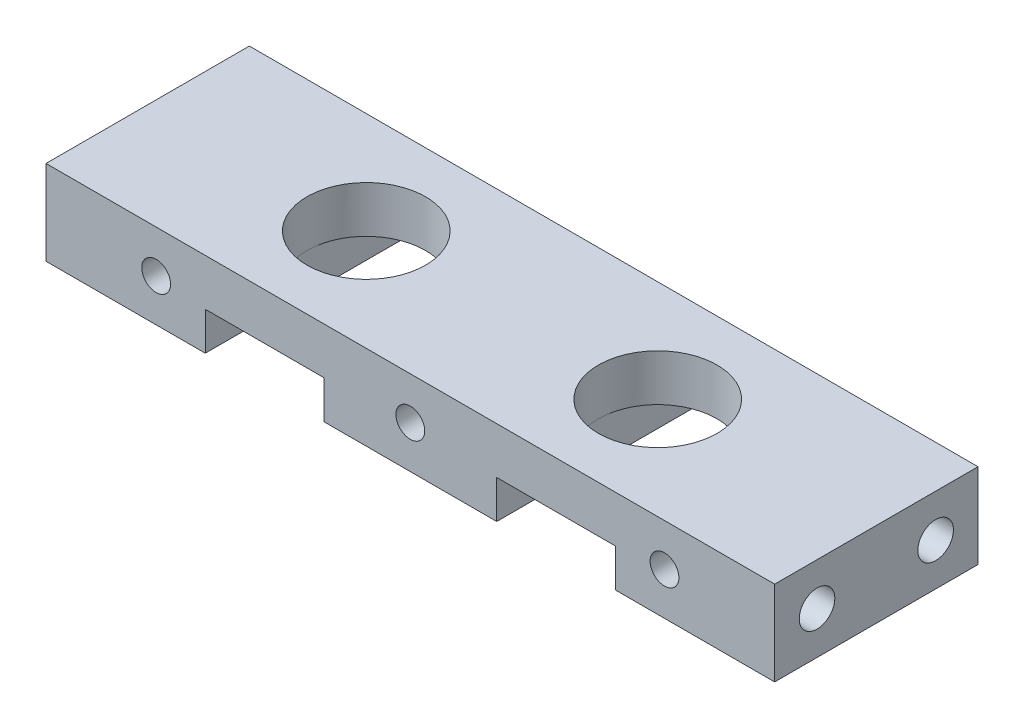
ISO-10303-21;
HEADER;
FILE_DESCRIPTION(('STEP AP214'),'2;1');
FILE_NAME('part.step','',(''),(''),'','','');
FILE_SCHEMA(('AUTOMOTIVE_DESIGN { 1 0 10303 214 1 1 1 1 }'));
ENDSEC;
DATA;
#1=APPLICATION_CONTEXT('core data for automotive mechanical design processes');
#2=APPLICATION_PROTOCOL_DEFINITION('international standard','automotive_design',2000,#1);
#3=PRODUCT_CONTEXT('',#1,'mechanical');
#4=PRODUCT('Part','Part','',(#3));
#5=PRODUCT_RELATED_PRODUCT_CATEGORY('part','',(#4));
#6=PRODUCT_DEFINITION_FORMATION('','',#4);
#7=PRODUCT_DEFINITION_CONTEXT('part definition',#1,'design');
#8=PRODUCT_DEFINITION('design','',#6,#7);
#9=PRODUCT_DEFINITION_SHAPE('','',#8);
#10=(LENGTH_UNIT() NAMED_UNIT(*) SI_UNIT(.MILLI.,.METRE.));
#11=(NAMED_UNIT(*) PLANE_ANGLE_UNIT() SI_UNIT($,.RADIAN.));
#12=(NAMED_UNIT(*) SI_UNIT($,.STERADIAN.) SOLID_ANGLE_UNIT());
#13=UNCERTAINTY_MEASURE_WITH_UNIT(LENGTH_MEASURE(1.E-05),#10,'distance_accuracy_value','');
#14=(GEOMETRIC_REPRESENTATION_CONTEXT(3) GLOBAL_UNCERTAINTY_ASSIGNED_CONTEXT((#13)) GLOBAL_UNIT_ASSIGNED_CONTEXT((#10,
#11,#12)) REPRESENTATION_CONTEXT('',''));
#15=CARTESIAN_POINT('',(0.,0.,0.));
#16=DIRECTION('',(0.,0.,1.));
#17=DIRECTION('',(1.,0.,0.));
#18=AXIS2_PLACEMENT_3D('',#15,#16,#17);
#19=CARTESIAN_POINT('',(17.5,2.5,-3.5));
#20=DIRECTION('',(-1.,0.,0.));
#21=DIRECTION('',(0.,0.,1.));
#22=AXIS2_PLACEMENT_3D('',#19,#20,#21);
#23=PLANE('',#22);
#24=CARTESIAN_POINT('',(17.5,2.5,-3.5));
#25=DIRECTION('',(1.,0.,0.));
#26=DIRECTION('',(0.,0.,-1.));
#27=AXIS2_PLACEMENT_3D('',#24,#25,#26);
#28=CIRCLE('',#27,1.05);
#29=CARTESIAN_POINT('',(17.5,2.5,-4.55));
#30=VERTEX_POINT('',#29);
#31=EDGE_CURVE('E38',#30,#30,#28,.T.);
#32=ORIENTED_EDGE('',*,*,#31,.T.);
#33=EDGE_LOOP('',(#32));
#34=FACE_BOUND('',#33,.T.);
#35=ADVANCED_FACE('F35',(#34),#23,.F.);
#36=CARTESIAN_POINT('',(17.5,2.5,3.5));
#37=DIRECTION('',(-1.,0.,0.));
#38=DIRECTION('',(0.,0.,1.));
#39=AXIS2_PLACEMENT_3D('',#36,#37,#38);
#40=PLANE('',#39);
#41=CARTESIAN_POINT('',(17.5,2.5,3.5));
#42=DIRECTION('',(1.,0.,0.));
#43=DIRECTION('',(0.,0.,-1.));
#44=AXIS2_PLACEMENT_3D('',#41,#42,#43);
#45=CIRCLE('',#44,1.05);
#46=CARTESIAN_POINT('',(17.5,2.5,2.45));
#47=VERTEX_POINT('',#46);
#48=EDGE_CURVE('E216',#47,#47,#45,.T.);
#49=ORIENTED_EDGE('',*,*,#48,.T.);
#50=EDGE_LOOP('',(#49));
#51=FACE_BOUND('',#50,.T.);
#52=ADVANCED_FACE('F632',(#51),#40,.F.);
#53=CARTESIAN_POINT('',(-17.5,2.5,-3.5));
#54=DIRECTION('',(-1.,0.,0.));
#55=DIRECTION('',(0.,0.,1.));
#56=AXIS2_PLACEMENT_3D('',#53,#54,#55);
#57=PLANE('',#56);
#58=CARTESIAN_POINT('',(-17.5,2.5,-3.5));
#59=DIRECTION('',(1.,0.,0.));
#60=DIRECTION('',(0.,0.,-1.));
#61=AXIS2_PLACEMENT_3D('',#58,#59,#60);
#62=CIRCLE('',#61,1.05);
#63=CARTESIAN_POINT('',(-17.5,2.5,-4.55));
#64=VERTEX_POINT('',#63);
#65=EDGE_CURVE('E214',#64,#64,#62,.F.);
#66=ORIENTED_EDGE('',*,*,#65,.T.);
#67=EDGE_LOOP('',(#66));
#68=FACE_BOUND('',#67,.T.);
#69=ADVANCED_FACE('F624',(#68),#57,.T.);
#70=CARTESIAN_POINT('',(-17.5,2.5,3.5));
#71=DIRECTION('',(-1.,0.,0.));
#72=DIRECTION('',(0.,0.,1.));
#73=AXIS2_PLACEMENT_3D('',#70,#71,#72);
#74=PLANE('',#73);
#75=CARTESIAN_POINT('',(-17.5,2.5,3.5));
#76=DIRECTION('',(1.,0.,0.));
#77=DIRECTION('',(0.,0.,-1.));
#78=AXIS2_PLACEMENT_3D('',#75,#76,#77);
#79=CIRCLE('',#78,1.05);
#80=CARTESIAN_POINT('',(-17.5,2.5,2.45));
#81=VERTEX_POINT('',#80);
#82=EDGE_CURVE('E210',#81,#81,#79,.F.);
#83=ORIENTED_EDGE('',*,*,#82,.T.);
#84=EDGE_LOOP('',(#83));
#85=FACE_BOUND('',#84,.T.);
#86=ADVANCED_FACE('F228',(#85),#74,.T.);
#87=CARTESIAN_POINT('',(21.5,2.5,-3.5));
#88=DIRECTION('',(1.,0.,0.));
#89=DIRECTION('',(0.,0.,-1.));
#90=AXIS2_PLACEMENT_3D('',#87,#88,#89);
#91=CYLINDRICAL_SURFACE('',#90,1.05);
#92=ORIENTED_EDGE('',*,*,#31,.F.);
#93=EDGE_LOOP('',(#92));
#94=FACE_BOUND('',#93,.T.);
#95=CARTESIAN_POINT('',(21.5,2.5,-3.5));
#96=DIRECTION('',(1.,0.,0.));
#97=DIRECTION('',(0.,0.,-1.));
#98=AXIS2_PLACEMENT_3D('',#95,#96,#97);
#99=CIRCLE('',#98,1.05);
#100=CARTESIAN_POINT('',(21.5,2.5,-4.55));
#101=VERTEX_POINT('',#100);
#102=EDGE_CURVE('E206',#101,#101,#99,.F.);
#103=ORIENTED_EDGE('',*,*,#102,.F.);
#104=EDGE_LOOP('',(#103));
#105=FACE_BOUND('',#104,.T.);
#106=ADVANCED_FACE('F224',(#94,#105),#91,.F.);
#107=CARTESIAN_POINT('',(21.5,2.5,3.5));
#108=DIRECTION('',(1.,0.,0.));
#109=DIRECTION('',(0.,0.,-1.));
#110=AXIS2_PLACEMENT_3D('',#107,#108,#109);
#111=CYLINDRICAL_SURFACE('',#110,1.05);
#112=ORIENTED_EDGE('',*,*,#48,.F.);
#113=EDGE_LOOP('',(#112));
#114=FACE_BOUND('',#113,.T.);
#115=CARTESIAN_POINT('',(21.5,2.5,3.5));
#116=DIRECTION('',(1.,0.,0.));
#117=DIRECTION('',(0.,0.,-1.));
#118=AXIS2_PLACEMENT_3D('',#115,#116,#117);
#119=CIRCLE('',#118,1.05);
#120=CARTESIAN_POINT('',(21.5,2.5,2.45));
#121=VERTEX_POINT('',#120);
#122=EDGE_CURVE('E202',#121,#121,#119,.F.);
#123=ORIENTED_EDGE('',*,*,#122,.F.);
#124=EDGE_LOOP('',(#123));
#125=FACE_BOUND('',#124,.T.);
#126=ADVANCED_FACE('F227',(#114,#125),#111,.F.);
#127=CARTESIAN_POINT('',(-21.5,2.5,-3.5));
#128=DIRECTION('',(1.,0.,0.));
#129=DIRECTION('',(0.,0.,-1.));
#130=AXIS2_PLACEMENT_3D('',#127,#128,#129);
#131=CYLINDRICAL_SURFACE('',#130,1.05);
#132=ORIENTED_EDGE('',*,*,#65,.F.);
#133=EDGE_LOOP('',(#132));
#134=FACE_BOUND('',#133,.T.);
#135=CARTESIAN_POINT('',(-21.5,2.5,-3.5));
#136=DIRECTION('',(1.,0.,0.));
#137=DIRECTION('',(0.,0.,-1.));
#138=AXIS2_PLACEMENT_3D('',#135,#136,#137);
#139=CIRCLE('',#138,1.05);
#140=CARTESIAN_POINT('',(-21.5,2.5,-4.55));
#141=VERTEX_POINT('',#140);
#142=EDGE_CURVE('E187',#141,#141,#139,.T.);
#143=ORIENTED_EDGE('',*,*,#142,.F.);
#144=EDGE_LOOP('',(#143));
#145=FACE_BOUND('',#144,.T.);
#146=ADVANCED_FACE('F589',(#134,#145),#131,.F.);
#147=CARTESIAN_POINT('',(-21.5,2.5,3.5));
#148=DIRECTION('',(1.,0.,0.));
#149=DIRECTION('',(0.,0.,-1.));
#150=AXIS2_PLACEMENT_3D('',#147,#148,#149);
#151=CYLINDRICAL_SURFACE('',#150,1.05);
#152=ORIENTED_EDGE('',*,*,#82,.F.);
#153=EDGE_LOOP('',(#152));
#154=FACE_BOUND('',#153,.T.);
#155=CARTESIAN_POINT('',(-21.5,2.5,3.5));
#156=DIRECTION('',(1.,0.,0.));
#157=DIRECTION('',(0.,0.,-1.));
#158=AXIS2_PLACEMENT_3D('',#155,#156,#157);
#159=CIRCLE('',#158,1.05);
#160=CARTESIAN_POINT('',(-21.5,2.5,2.45));
#161=VERTEX_POINT('',#160);
#162=EDGE_CURVE('E183',#161,#161,#159,.T.);
#163=ORIENTED_EDGE('',*,*,#162,.F.);
#164=EDGE_LOOP('',(#163));
#165=FACE_BOUND('',#164,.T.);
#166=ADVANCED_FACE('F598',(#154,#165),#151,.F.);
#167=CARTESIAN_POINT('',(-5.1,0.,9.06162749492311));
#168=DIRECTION('',(1.,0.,0.));
#169=DIRECTION('',(0.,0.,-1.));
#170=AXIS2_PLACEMENT_3D('',#167,#168,#169);
#171=PLANE('',#170);
#172=DIRECTION('',(0.,0.,-1.));
#173=VECTOR('',#172,1.);
#174=CARTESIAN_POINT('',(-5.1,2.25,4.53081374746156));
#175=LINE('',#174,#173);
#176=CARTESIAN_POINT('',(-5.1,2.25,0.));
#177=VERTEX_POINT('',#176);
#178=CARTESIAN_POINT('',(-5.1,2.25,6.));
#179=VERTEX_POINT('',#178);
#180=EDGE_CURVE('E309',#177,#179,#175,.F.);
#181=ORIENTED_EDGE('',*,*,#180,.F.);
#182=DIRECTION('',(0.,0.,-1.));
#183=VECTOR('',#182,1.);
#184=CARTESIAN_POINT('',(-5.1,2.25,-4.53081374746156));
#185=LINE('',#184,#183);
#186=CARTESIAN_POINT('',(-5.1,2.25,-6.));
#187=VERTEX_POINT('',#186);
#188=EDGE_CURVE('E304',#187,#177,#185,.F.);
#189=ORIENTED_EDGE('',*,*,#188,.F.);
#190=DIRECTION('',(0.,1.,0.));
#191=VECTOR('',#190,1.);
#192=CARTESIAN_POINT('',(-5.1,0.,-6.));
#193=LINE('',#192,#191);
#194=CARTESIAN_POINT('',(-5.1,0.,-6.));
#195=VERTEX_POINT('',#194);
#196=EDGE_CURVE('E287',#195,#187,#193,.T.);
#197=ORIENTED_EDGE('',*,*,#196,.F.);
#198=DIRECTION('',(0.,0.,1.));
#199=VECTOR('',#198,1.);
#200=CARTESIAN_POINT('',(-5.1,0.,0.));
#201=LINE('',#200,#199);
#202=CARTESIAN_POINT('',(-5.1,0.,6.));
#203=VERTEX_POINT('',#202);
#204=EDGE_CURVE('E329',#195,#203,#201,.T.);
#205=ORIENTED_EDGE('',*,*,#204,.T.);
#206=DIRECTION('',(0.,1.,0.));
#207=VECTOR('',#206,1.);
#208=CARTESIAN_POINT('',(-5.1,0.,6.00000000000001));
#209=LINE('',#208,#207);
#210=EDGE_CURVE('E186',#179,#203,#209,.F.);
#211=ORIENTED_EDGE('',*,*,#210,.F.);
#212=EDGE_LOOP('',(#181,#189,#197,#205,#211));
#213=FACE_BOUND('',#212,.T.);
#214=ADVANCED_FACE('F395',(#213),#171,.F.);
#215=CARTESIAN_POINT('',(5.1,0.,-8.60665038220731));
#216=DIRECTION('',(-1.,0.,0.));
#217=DIRECTION('',(0.,0.,1.));
#218=AXIS2_PLACEMENT_3D('',#215,#216,#217);
#219=PLANE('',#218);
#220=DIRECTION('',(0.,0.,-1.));
#221=VECTOR('',#220,1.);
#222=CARTESIAN_POINT('',(5.1,2.25,-4.30332519110366));
#223=LINE('',#222,#221);
#224=CARTESIAN_POINT('',(5.1,2.25,0.));
#225=VERTEX_POINT('',#224);
#226=CARTESIAN_POINT('',(5.1,2.25,-6.));
#227=VERTEX_POINT('',#226);
#228=EDGE_CURVE('E137',#225,#227,#223,.T.);
#229=ORIENTED_EDGE('',*,*,#228,.F.);
#230=DIRECTION('',(0.,0.,-1.));
#231=VECTOR('',#230,1.);
#232=CARTESIAN_POINT('',(5.1,2.25,4.30332519110365));
#233=LINE('',#232,#231);
#234=CARTESIAN_POINT('',(5.1,2.25,6.));
#235=VERTEX_POINT('',#234);
#236=EDGE_CURVE('E142',#235,#225,#233,.T.);
#237=ORIENTED_EDGE('',*,*,#236,.F.);
#238=DIRECTION('',(0.,1.,0.));
#239=VECTOR('',#238,1.);
#240=CARTESIAN_POINT('',(5.1,0.,6.00000000000001));
#241=LINE('',#240,#239);
#242=CARTESIAN_POINT('',(5.1,0.,6.));
#243=VERTEX_POINT('',#242);
#244=EDGE_CURVE('E280',#243,#235,#241,.T.);
#245=ORIENTED_EDGE('',*,*,#244,.F.);
#246=DIRECTION('',(0.,0.,1.));
#247=VECTOR('',#246,1.);
#248=CARTESIAN_POINT('',(5.1,0.,0.));
#249=LINE('',#248,#247);
#250=CARTESIAN_POINT('',(5.1,0.,-6.));
#251=VERTEX_POINT('',#250);
#252=EDGE_CURVE('E213',#243,#251,#249,.F.);
#253=ORIENTED_EDGE('',*,*,#252,.T.);
#254=DIRECTION('',(0.,1.,0.));
#255=VECTOR('',#254,1.);
#256=CARTESIAN_POINT('',(5.1,0.,-6.00000000000001));
#257=LINE('',#256,#255);
#258=EDGE_CURVE('E145',#227,#251,#257,.F.);
#259=ORIENTED_EDGE('',*,*,#258,.F.);
#260=EDGE_LOOP('',(#229,#237,#245,#253,#259));
#261=FACE_BOUND('',#260,.T.);
#262=ADVANCED_FACE('F139',(#261),#219,.F.);
#263=CARTESIAN_POINT('',(12.1,0.,0.));
#264=DIRECTION('',(1.,0.,0.));
#265=DIRECTION('',(0.,0.,-1.));
#266=AXIS2_PLACEMENT_3D('',#263,#264,#265);
#267=PLANE('',#266);
#268=DIRECTION('',(0.,0.,1.));
#269=VECTOR('',#268,1.);
#270=CARTESIAN_POINT('',(12.1,0.,0.));
#271=LINE('',#270,#269);
#272=CARTESIAN_POINT('',(12.1,0.,-6.00000000000001));
#273=VERTEX_POINT('',#272);
#274=CARTESIAN_POINT('',(12.1,0.,6.));
#275=VERTEX_POINT('',#274);
#276=EDGE_CURVE('E297',#273,#275,#271,.T.);
#277=ORIENTED_EDGE('',*,*,#276,.T.);
#278=DIRECTION('',(0.,1.,0.));
#279=VECTOR('',#278,1.);
#280=CARTESIAN_POINT('',(12.1,0.,6.00000000000001));
#281=LINE('',#280,#279);
#282=CARTESIAN_POINT('',(12.1,2.25,6.));
#283=VERTEX_POINT('',#282);
#284=EDGE_CURVE('E276',#283,#275,#281,.F.);
#285=ORIENTED_EDGE('',*,*,#284,.F.);
#286=DIRECTION('',(0.,0.,-1.));
#287=VECTOR('',#286,1.);
#288=CARTESIAN_POINT('',(12.1,2.25,4.30332519110365));
#289=LINE('',#288,#287);
#290=CARTESIAN_POINT('',(12.1,2.25,0.));
#291=VERTEX_POINT('',#290);
#292=EDGE_CURVE('E132',#291,#283,#289,.F.);
#293=ORIENTED_EDGE('',*,*,#292,.F.);
#294=DIRECTION('',(0.,0.,-1.));
#295=VECTOR('',#294,1.);
#296=CARTESIAN_POINT('',(12.1,2.25,-4.30332519110366));
#297=LINE('',#296,#295);
#298=CARTESIAN_POINT('',(12.1,2.25,-6.));
#299=VERTEX_POINT('',#298);
#300=EDGE_CURVE('E149',#299,#291,#297,.F.);
#301=ORIENTED_EDGE('',*,*,#300,.F.);
#302=DIRECTION('',(0.,1.,0.));
#303=VECTOR('',#302,1.);
#304=CARTESIAN_POINT('',(12.1,0.,-6.00000000000001));
#305=LINE('',#304,#303);
#306=EDGE_CURVE('E291',#273,#299,#305,.T.);
#307=ORIENTED_EDGE('',*,*,#306,.F.);
#308=EDGE_LOOP('',(#277,#285,#293,#301,#307));
#309=FACE_BOUND('',#308,.T.);
#310=ADVANCED_FACE('F404',(#309),#267,.F.);
#311=CARTESIAN_POINT('',(-12.1,0.,0.));
#312=DIRECTION('',(-1.,0.,0.));
#313=DIRECTION('',(0.,0.,1.));
#314=AXIS2_PLACEMENT_3D('',#311,#312,#313);
#315=PLANE('',#314);
#316=DIRECTION('',(0.,0.,1.));
#317=VECTOR('',#316,1.);
#318=CARTESIAN_POINT('',(-12.1,0.,0.));
#319=LINE('',#318,#317);
#320=CARTESIAN_POINT('',(-12.1,0.,6.00000000000001));
#321=VERTEX_POINT('',#320);
#322=CARTESIAN_POINT('',(-12.1,0.,-6.));
#323=VERTEX_POINT('',#322);
#324=EDGE_CURVE('E299',#321,#323,#319,.F.);
#325=ORIENTED_EDGE('',*,*,#324,.T.);
#326=DIRECTION('',(0.,1.,0.));
#327=VECTOR('',#326,1.);
#328=CARTESIAN_POINT('',(-12.1,0.,-6.));
#329=LINE('',#328,#327);
#330=CARTESIAN_POINT('',(-12.1,2.25,-6.));
#331=VERTEX_POINT('',#330);
#332=EDGE_CURVE('E205',#331,#323,#329,.F.);
#333=ORIENTED_EDGE('',*,*,#332,.F.);
#334=DIRECTION('',(0.,0.,-1.));
#335=VECTOR('',#334,1.);
#336=CARTESIAN_POINT('',(-12.1,2.25,-4.53081374746156));
#337=LINE('',#336,#335);
#338=CARTESIAN_POINT('',(-12.1,2.25,0.));
#339=VERTEX_POINT('',#338);
#340=EDGE_CURVE('E301',#339,#331,#337,.T.);
#341=ORIENTED_EDGE('',*,*,#340,.F.);
#342=DIRECTION('',(0.,0.,-1.));
#343=VECTOR('',#342,1.);
#344=CARTESIAN_POINT('',(-12.1,2.25,4.53081374746156));
#345=LINE('',#344,#343);
#346=CARTESIAN_POINT('',(-12.1,2.25,6.));
#347=VERTEX_POINT('',#346);
#348=EDGE_CURVE('E314',#347,#339,#345,.T.);
#349=ORIENTED_EDGE('',*,*,#348,.F.);
#350=DIRECTION('',(0.,1.,0.));
#351=VECTOR('',#350,1.);
#352=CARTESIAN_POINT('',(-12.1,0.,6.00000000000001));
#353=LINE('',#352,#351);
#354=EDGE_CURVE('E273',#321,#347,#353,.T.);
#355=ORIENTED_EDGE('',*,*,#354,.F.);
#356=EDGE_LOOP('',(#325,#333,#341,#349,#355));
#357=FACE_BOUND('',#356,.T.);
#358=ADVANCED_FACE('F389',(#357),#315,.F.);
#359=CARTESIAN_POINT('',(15.,2.5,-6.));
#360=DIRECTION('',(0.,0.,1.));
#361=DIRECTION('',(1.,0.,0.));
#362=AXIS2_PLACEMENT_3D('',#359,#360,#361);
#363=CYLINDRICAL_SURFACE('',#362,0.85);
#364=CARTESIAN_POINT('',(15.,2.5,6.));
#365=DIRECTION('',(0.,0.,1.));
#366=DIRECTION('',(1.,0.,0.));
#367=AXIS2_PLACEMENT_3D('',#364,#365,#366);
#368=CIRCLE('',#367,0.85);
#369=CARTESIAN_POINT('',(15.85,2.5,6.));
#370=VERTEX_POINT('',#369);
#371=EDGE_CURVE('E179',#370,#370,#368,.F.);
#372=ORIENTED_EDGE('',*,*,#371,.F.);
#373=EDGE_LOOP('',(#372));
#374=FACE_BOUND('',#373,.T.);
#375=CARTESIAN_POINT('',(15.,2.5,-6.00000000000001));
#376=DIRECTION('',(0.,0.,1.));
#377=DIRECTION('',(1.,0.,0.));
#378=AXIS2_PLACEMENT_3D('',#375,#376,#377);
#379=CIRCLE('',#378,0.85);
#380=CARTESIAN_POINT('',(15.85,2.5,-6.00000000000001));
#381=VERTEX_POINT('',#380);
#382=EDGE_CURVE('E198',#381,#381,#379,.T.);
#383=ORIENTED_EDGE('',*,*,#382,.F.);
#384=EDGE_LOOP('',(#383));
#385=FACE_BOUND('',#384,.T.);
#386=ADVANCED_FACE('F411',(#374,#385),#363,.F.);
#387=CARTESIAN_POINT('',(-15.,2.5,-6.));
#388=DIRECTION('',(0.,0.,1.));
#389=DIRECTION('',(1.,0.,0.));
#390=AXIS2_PLACEMENT_3D('',#387,#388,#389);
#391=CYLINDRICAL_SURFACE('',#390,0.85);
#392=CARTESIAN_POINT('',(-15.,2.5,6.));
#393=DIRECTION('',(0.,0.,1.));
#394=DIRECTION('',(1.,0.,0.));
#395=AXIS2_PLACEMENT_3D('',#392,#393,#394);
#396=CIRCLE('',#395,0.85);
#397=CARTESIAN_POINT('',(-14.15,2.5,6.));
#398=VERTEX_POINT('',#397);
#399=EDGE_CURVE('E176',#398,#398,#396,.F.);
#400=ORIENTED_EDGE('',*,*,#399,.F.);
#401=EDGE_LOOP('',(#400));
#402=FACE_BOUND('',#401,.T.);
#403=CARTESIAN_POINT('',(-15.,2.5,-6.));
#404=DIRECTION('',(0.,0.,1.));
#405=DIRECTION('',(1.,0.,0.));
#406=AXIS2_PLACEMENT_3D('',#403,#404,#405);
#407=CIRCLE('',#406,0.85);
#408=CARTESIAN_POINT('',(-14.15,2.5,-6.));
#409=VERTEX_POINT('',#408);
#410=EDGE_CURVE('E195',#409,#409,#407,.T.);
#411=ORIENTED_EDGE('',*,*,#410,.F.);
#412=EDGE_LOOP('',(#411));
#413=FACE_BOUND('',#412,.T.);
#414=ADVANCED_FACE('F455',(#402,#413),#391,.F.);
#415=CARTESIAN_POINT('',(0.,2.5,-6.));
#416=DIRECTION('',(0.,0.,1.));
#417=DIRECTION('',(1.,0.,0.));
#418=AXIS2_PLACEMENT_3D('',#415,#416,#417);
#419=CYLINDRICAL_SURFACE('',#418,0.85);
#420=CARTESIAN_POINT('',(0.,2.5,6.));
#421=DIRECTION('',(0.,0.,1.));
#422=DIRECTION('',(1.,0.,0.));
#423=AXIS2_PLACEMENT_3D('',#420,#421,#422);
#424=CIRCLE('',#423,0.85);
#425=CARTESIAN_POINT('',(0.850000000000003,2.5,6.));
#426=VERTEX_POINT('',#425);
#427=EDGE_CURVE('E158',#426,#426,#424,.F.);
#428=ORIENTED_EDGE('',*,*,#427,.F.);
#429=EDGE_LOOP('',(#428));
#430=FACE_BOUND('',#429,.T.);
#431=CARTESIAN_POINT('',(0.,2.5,-6.));
#432=DIRECTION('',(0.,0.,1.));
#433=DIRECTION('',(1.,0.,0.));
#434=AXIS2_PLACEMENT_3D('',#431,#432,#433);
#435=CIRCLE('',#434,0.85);
#436=CARTESIAN_POINT('',(0.85,2.5,-6.));
#437=VERTEX_POINT('',#436);
#438=EDGE_CURVE('E191',#437,#437,#435,.T.);
#439=ORIENTED_EDGE('',*,*,#438,.F.);
#440=EDGE_LOOP('',(#439));
#441=FACE_BOUND('',#440,.T.);
#442=ADVANCED_FACE('F451',(#430,#441),#419,.F.);
#443=CARTESIAN_POINT('',(0.,0.,0.));
#444=DIRECTION('',(0.,1.,0.));
#445=DIRECTION('',(0.,0.,1.));
#446=AXIS2_PLACEMENT_3D('',#443,#444,#445);
#447=PLANE('',#446);
#448=DIRECTION('',(-1.,0.,0.));
#449=VECTOR('',#448,1.);
#450=CARTESIAN_POINT('',(21.5,0.,-6.00000000000001));
#451=LINE('',#450,#449);
#452=EDGE_CURVE('E284',#251,#195,#451,.T.);
#453=ORIENTED_EDGE('',*,*,#452,.F.);
#454=ORIENTED_EDGE('',*,*,#252,.F.);
#455=DIRECTION('',(1.,0.,0.));
#456=VECTOR('',#455,1.);
#457=CARTESIAN_POINT('',(-21.5,0.,6.00000000000001));
#458=LINE('',#457,#456);
#459=EDGE_CURVE('E277',#203,#243,#458,.T.);
#460=ORIENTED_EDGE('',*,*,#459,.F.);
#461=ORIENTED_EDGE('',*,*,#204,.F.);
#462=EDGE_LOOP('',(#453,#454,#460,#461));
#463=FACE_BOUND('',#462,.T.);
#464=ADVANCED_FACE('F448',(#463),#447,.F.);
#465=CARTESIAN_POINT('',(8.6,2.25,-4.30332519110366));
#466=DIRECTION('',(0.,-1.,0.));
#467=DIRECTION('',(0.,0.,-1.));
#468=AXIS2_PLACEMENT_3D('',#465,#466,#467);
#469=PLANE('',#468);
#470=CARTESIAN_POINT('',(8.6,2.25,0.));
#471=DIRECTION('',(0.,1.,0.));
#472=DIRECTION('',(0.,0.,1.));
#473=AXIS2_PLACEMENT_3D('',#470,#471,#472);
#474=CIRCLE('',#473,3.5);
#475=EDGE_CURVE('E152',#291,#225,#474,.T.);
#476=ORIENTED_EDGE('',*,*,#475,.T.);
#477=ORIENTED_EDGE('',*,*,#228,.T.);
#478=DIRECTION('',(-1.,0.,0.));
#479=VECTOR('',#478,1.);
#480=CARTESIAN_POINT('',(21.5,2.25,-6.00000000000001));
#481=LINE('',#480,#479);
#482=EDGE_CURVE('E367',#299,#227,#481,.T.);
#483=ORIENTED_EDGE('',*,*,#482,.F.);
#484=ORIENTED_EDGE('',*,*,#300,.T.);
#485=EDGE_LOOP('',(#476,#477,#483,#484));
#486=FACE_BOUND('',#485,.T.);
#487=ADVANCED_FACE('F153',(#486),#469,.T.);
#488=CARTESIAN_POINT('',(8.6,2.25,4.30332519110365));
#489=DIRECTION('',(0.,-1.,0.));
#490=DIRECTION('',(0.,0.,-1.));
#491=AXIS2_PLACEMENT_3D('',#488,#489,#490);
#492=PLANE('',#491);
#493=CARTESIAN_POINT('',(8.6,2.25,0.));
#494=DIRECTION('',(0.,1.,0.));
#495=DIRECTION('',(0.,0.,1.));
#496=AXIS2_PLACEMENT_3D('',#493,#494,#495);
#497=CIRCLE('',#496,3.5);
#498=EDGE_CURVE('E157',#225,#291,#497,.T.);
#499=ORIENTED_EDGE('',*,*,#498,.T.);
#500=ORIENTED_EDGE('',*,*,#292,.T.);
#501=DIRECTION('',(1.,0.,0.));
#502=VECTOR('',#501,1.);
#503=CARTESIAN_POINT('',(-21.5,2.25,6.00000000000001));
#504=LINE('',#503,#502);
#505=EDGE_CURVE('E163',#235,#283,#504,.T.);
#506=ORIENTED_EDGE('',*,*,#505,.F.);
#507=ORIENTED_EDGE('',*,*,#236,.T.);
#508=EDGE_LOOP('',(#499,#500,#506,#507));
#509=FACE_BOUND('',#508,.T.);
#510=ADVANCED_FACE('F161',(#509),#492,.T.);
#511=CARTESIAN_POINT('',(-8.6,2.25,4.53081374746156));
#512=DIRECTION('',(0.,-1.,0.));
#513=DIRECTION('',(0.,0.,-1.));
#514=AXIS2_PLACEMENT_3D('',#511,#512,#513);
#515=PLANE('',#514);
#516=CARTESIAN_POINT('',(-8.6,2.25,0.));
#517=DIRECTION('',(0.,1.,0.));
#518=DIRECTION('',(0.,0.,1.));
#519=AXIS2_PLACEMENT_3D('',#516,#517,#518);
#520=CIRCLE('',#519,3.5);
#521=EDGE_CURVE('E167',#339,#177,#520,.T.);
#522=ORIENTED_EDGE('',*,*,#521,.T.);
#523=ORIENTED_EDGE('',*,*,#180,.T.);
#524=DIRECTION('',(1.,0.,0.));
#525=VECTOR('',#524,1.);
#526=CARTESIAN_POINT('',(-21.5,2.25,6.00000000000001));
#527=LINE('',#526,#525);
#528=EDGE_CURVE('E182',#347,#179,#527,.T.);
#529=ORIENTED_EDGE('',*,*,#528,.F.);
#530=ORIENTED_EDGE('',*,*,#348,.T.);
#531=EDGE_LOOP('',(#522,#523,#529,#530));
#532=FACE_BOUND('',#531,.T.);
#533=ADVANCED_FACE('F385',(#532),#515,.T.);
#534=CARTESIAN_POINT('',(-8.6,2.25,-4.53081374746156));
#535=DIRECTION('',(0.,-1.,0.));
#536=DIRECTION('',(0.,0.,-1.));
#537=AXIS2_PLACEMENT_3D('',#534,#535,#536);
#538=PLANE('',#537);
#539=CARTESIAN_POINT('',(-8.6,2.25,0.));
#540=DIRECTION('',(0.,1.,0.));
#541=DIRECTION('',(0.,0.,1.));
#542=AXIS2_PLACEMENT_3D('',#539,#540,#541);
#543=CIRCLE('',#542,3.5);
#544=EDGE_CURVE('E170',#177,#339,#543,.T.);
#545=ORIENTED_EDGE('',*,*,#544,.T.);
#546=ORIENTED_EDGE('',*,*,#340,.T.);
#547=DIRECTION('',(-1.,0.,0.));
#548=VECTOR('',#547,1.);
#549=CARTESIAN_POINT('',(21.5,2.25,-6.00000000000001));
#550=LINE('',#549,#548);
#551=EDGE_CURVE('E201',#187,#331,#550,.T.);
#552=ORIENTED_EDGE('',*,*,#551,.F.);
#553=ORIENTED_EDGE('',*,*,#188,.T.);
#554=EDGE_LOOP('',(#545,#546,#552,#553));
#555=FACE_BOUND('',#554,.T.);
#556=ADVANCED_FACE('F380',(#555),#538,.T.);
#557=CARTESIAN_POINT('',(0.,0.,0.));
#558=DIRECTION('',(0.,1.,0.));
#559=DIRECTION('',(0.,0.,1.));
#560=AXIS2_PLACEMENT_3D('',#557,#558,#559);
#561=PLANE('',#560);
#562=DIRECTION('',(1.,0.,0.));
#563=VECTOR('',#562,1.);
#564=CARTESIAN_POINT('',(-21.5,0.,6.00000000000001));
#565=LINE('',#564,#563);
#566=CARTESIAN_POINT('',(-21.5,0.,6.00000000000001));
#567=VERTEX_POINT('',#566);
#568=EDGE_CURVE('E270',#567,#321,#565,.T.);
#569=ORIENTED_EDGE('',*,*,#568,.F.);
#570=DIRECTION('',(0.,0.,1.));
#571=VECTOR('',#570,1.);
#572=CARTESIAN_POINT('',(-21.5,0.,-6.));
#573=LINE('',#572,#571);
#574=CARTESIAN_POINT('',(-21.5,0.,-6.));
#575=VERTEX_POINT('',#574);
#576=EDGE_CURVE('E194',#575,#567,#573,.T.);
#577=ORIENTED_EDGE('',*,*,#576,.F.);
#578=DIRECTION('',(-1.,0.,0.));
#579=VECTOR('',#578,1.);
#580=CARTESIAN_POINT('',(21.5,0.,-6.00000000000001));
#581=LINE('',#580,#579);
#582=EDGE_CURVE('E293',#323,#575,#581,.T.);
#583=ORIENTED_EDGE('',*,*,#582,.F.);
#584=ORIENTED_EDGE('',*,*,#324,.F.);
#585=EDGE_LOOP('',(#569,#577,#583,#584));
#586=FACE_BOUND('',#585,.T.);
#587=ADVANCED_FACE('F399',(#586),#561,.F.);
#588=CARTESIAN_POINT('',(0.,0.,0.));
#589=DIRECTION('',(0.,1.,0.));
#590=DIRECTION('',(0.,0.,1.));
#591=AXIS2_PLACEMENT_3D('',#588,#589,#590);
#592=PLANE('',#591);
#593=DIRECTION('',(-1.,0.,0.));
#594=VECTOR('',#593,1.);
#595=CARTESIAN_POINT('',(21.5,0.,-6.00000000000001));
#596=LINE('',#595,#594);
#597=CARTESIAN_POINT('',(21.5,0.,-6.00000000000001));
#598=VERTEX_POINT('',#597);
#599=EDGE_CURVE('E288',#598,#273,#596,.T.);
#600=ORIENTED_EDGE('',*,*,#599,.F.);
#601=DIRECTION('',(0.,0.,-1.));
#602=VECTOR('',#601,1.);
#603=CARTESIAN_POINT('',(21.5,0.,6.));
#604=LINE('',#603,#602);
#605=CARTESIAN_POINT('',(21.5,0.,6.));
#606=VERTEX_POINT('',#605);
#607=EDGE_CURVE('E209',#606,#598,#604,.T.);
#608=ORIENTED_EDGE('',*,*,#607,.F.);
#609=DIRECTION('',(1.,0.,0.));
#610=VECTOR('',#609,1.);
#611=CARTESIAN_POINT('',(-21.5,0.,6.00000000000001));
#612=LINE('',#611,#610);
#613=EDGE_CURVE('E260',#275,#606,#612,.T.);
#614=ORIENTED_EDGE('',*,*,#613,.F.);
#615=ORIENTED_EDGE('',*,*,#276,.F.);
#616=EDGE_LOOP('',(#600,#608,#614,#615));
#617=FACE_BOUND('',#616,.T.);
#618=ADVANCED_FACE('F236',(#617),#592,.F.);
#619=CARTESIAN_POINT('',(21.5,0.,6.));
#620=DIRECTION('',(1.,0.,0.));
#621=DIRECTION('',(0.,0.,-1.));
#622=AXIS2_PLACEMENT_3D('',#619,#620,#621);
#623=PLANE('',#622);
#624=ORIENTED_EDGE('',*,*,#122,.T.);
#625=EDGE_LOOP('',(#624));
#626=FACE_BOUND('',#625,.T.);
#627=ORIENTED_EDGE('',*,*,#102,.T.);
#628=EDGE_LOOP('',(#627));
#629=FACE_BOUND('',#628,.T.);
#630=DIRECTION('',(0.,0.,1.));
#631=VECTOR('',#630,1.);
#632=CARTESIAN_POINT('',(21.5,5.,0.));
#633=LINE('',#632,#631);
#634=CARTESIAN_POINT('',(21.5,5.,6.));
#635=VERTEX_POINT('',#634);
#636=CARTESIAN_POINT('',(21.5,5.,-6.00000000000001));
#637=VERTEX_POINT('',#636);
#638=EDGE_CURVE('E241',#635,#637,#633,.F.);
#639=ORIENTED_EDGE('',*,*,#638,.F.);
#640=DIRECTION('',(0.,1.,0.));
#641=VECTOR('',#640,1.);
#642=CARTESIAN_POINT('',(21.5,0.,6.00000000000001));
#643=LINE('',#642,#641);
#644=EDGE_CURVE('E243',#606,#635,#643,.T.);
#645=ORIENTED_EDGE('',*,*,#644,.F.);
#646=ORIENTED_EDGE('',*,*,#607,.T.);
#647=DIRECTION('',(0.,1.,0.));
#648=VECTOR('',#647,1.);
#649=CARTESIAN_POINT('',(21.5,0.,-6.00000000000001));
#650=LINE('',#649,#648);
#651=EDGE_CURVE('E246',#637,#598,#650,.F.);
#652=ORIENTED_EDGE('',*,*,#651,.F.);
#653=EDGE_LOOP('',(#639,#645,#646,#652));
#654=FACE_BOUND('',#653,.T.);
#655=ADVANCED_FACE('F232',(#626,#629,#654),#623,.T.);
#656=CARTESIAN_POINT('',(21.5,0.,-6.00000000000001));
#657=DIRECTION('',(0.,0.,-1.));
#658=DIRECTION('',(-1.,0.,0.));
#659=AXIS2_PLACEMENT_3D('',#656,#657,#658);
#660=PLANE('',#659);
#661=ORIENTED_EDGE('',*,*,#438,.T.);
#662=EDGE_LOOP('',(#661));
#663=FACE_BOUND('',#662,.T.);
#664=ORIENTED_EDGE('',*,*,#410,.T.);
#665=EDGE_LOOP('',(#664));
#666=FACE_BOUND('',#665,.T.);
#667=ORIENTED_EDGE('',*,*,#382,.T.);
#668=EDGE_LOOP('',(#667));
#669=FACE_BOUND('',#668,.T.);
#670=ORIENTED_EDGE('',*,*,#196,.T.);
#671=ORIENTED_EDGE('',*,*,#551,.T.);
#672=ORIENTED_EDGE('',*,*,#332,.T.);
#673=ORIENTED_EDGE('',*,*,#582,.T.);
#674=DIRECTION('',(0.,1.,0.));
#675=VECTOR('',#674,1.);
#676=CARTESIAN_POINT('',(-21.5,0.,-6.));
#677=LINE('',#676,#675);
#678=CARTESIAN_POINT('',(-21.5,5.,-6.));
#679=VERTEX_POINT('',#678);
#680=EDGE_CURVE('E190',#679,#575,#677,.F.);
#681=ORIENTED_EDGE('',*,*,#680,.F.);
#682=DIRECTION('',(1.,0.,0.));
#683=VECTOR('',#682,1.);
#684=CARTESIAN_POINT('',(0.,5.,-6.00000000000001));
#685=LINE('',#684,#683);
#686=EDGE_CURVE('E251',#637,#679,#685,.F.);
#687=ORIENTED_EDGE('',*,*,#686,.F.);
#688=ORIENTED_EDGE('',*,*,#651,.T.);
#689=ORIENTED_EDGE('',*,*,#599,.T.);
#690=ORIENTED_EDGE('',*,*,#306,.T.);
#691=ORIENTED_EDGE('',*,*,#482,.T.);
#692=ORIENTED_EDGE('',*,*,#258,.T.);
#693=ORIENTED_EDGE('',*,*,#452,.T.);
#694=EDGE_LOOP('',(#670,#671,#672,#673,#681,#687,#688,#689,#690,#691,#692,#693));
#695=FACE_BOUND('',#694,.T.);
#696=ADVANCED_FACE('F235',(#663,#666,#669,#695),#660,.T.);
#697=CARTESIAN_POINT('',(-21.5,0.,-6.));
#698=DIRECTION('',(-1.,0.,0.));
#699=DIRECTION('',(0.,0.,1.));
#700=AXIS2_PLACEMENT_3D('',#697,#698,#699);
#701=PLANE('',#700);
#702=ORIENTED_EDGE('',*,*,#162,.T.);
#703=EDGE_LOOP('',(#702));
#704=FACE_BOUND('',#703,.T.);
#705=ORIENTED_EDGE('',*,*,#142,.T.);
#706=EDGE_LOOP('',(#705));
#707=FACE_BOUND('',#706,.T.);
#708=DIRECTION('',(0.,0.,1.));
#709=VECTOR('',#708,1.);
#710=CARTESIAN_POINT('',(-21.5,5.,0.));
#711=LINE('',#710,#709);
#712=CARTESIAN_POINT('',(-21.5,5.,6.00000000000001));
#713=VERTEX_POINT('',#712);
#714=EDGE_CURVE('E263',#679,#713,#711,.T.);
#715=ORIENTED_EDGE('',*,*,#714,.F.);
#716=ORIENTED_EDGE('',*,*,#680,.T.);
#717=ORIENTED_EDGE('',*,*,#576,.T.);
#718=DIRECTION('',(0.,1.,0.));
#719=VECTOR('',#718,1.);
#720=CARTESIAN_POINT('',(-21.5,0.,6.00000000000001));
#721=LINE('',#720,#719);
#722=EDGE_CURVE('E53',#713,#567,#721,.F.);
#723=ORIENTED_EDGE('',*,*,#722,.F.);
#724=EDGE_LOOP('',(#715,#716,#717,#723));
#725=FACE_BOUND('',#724,.T.);
#726=ADVANCED_FACE('F400',(#704,#707,#725),#701,.T.);
#727=CARTESIAN_POINT('',(-21.5,0.,6.00000000000001));
#728=DIRECTION('',(0.,0.,1.));
#729=DIRECTION('',(1.,0.,0.));
#730=AXIS2_PLACEMENT_3D('',#727,#728,#729);
#731=PLANE('',#730);
#732=ORIENTED_EDGE('',*,*,#427,.T.);
#733=EDGE_LOOP('',(#732));
#734=FACE_BOUND('',#733,.T.);
#735=ORIENTED_EDGE('',*,*,#399,.T.);
#736=EDGE_LOOP('',(#735));
#737=FACE_BOUND('',#736,.T.);
#738=ORIENTED_EDGE('',*,*,#371,.T.);
#739=EDGE_LOOP('',(#738));
#740=FACE_BOUND('',#739,.T.);
#741=ORIENTED_EDGE('',*,*,#354,.T.);
#742=ORIENTED_EDGE('',*,*,#528,.T.);
#743=ORIENTED_EDGE('',*,*,#210,.T.);
#744=ORIENTED_EDGE('',*,*,#459,.T.);
#745=ORIENTED_EDGE('',*,*,#244,.T.);
#746=ORIENTED_EDGE('',*,*,#505,.T.);
#747=ORIENTED_EDGE('',*,*,#284,.T.);
#748=ORIENTED_EDGE('',*,*,#613,.T.);
#749=ORIENTED_EDGE('',*,*,#644,.T.);
#750=DIRECTION('',(1.,0.,0.));
#751=VECTOR('',#750,1.);
#752=CARTESIAN_POINT('',(0.,5.,6.00000000000001));
#753=LINE('',#752,#751);
#754=EDGE_CURVE('E256',#713,#635,#753,.T.);
#755=ORIENTED_EDGE('',*,*,#754,.F.);
#756=ORIENTED_EDGE('',*,*,#722,.T.);
#757=ORIENTED_EDGE('',*,*,#568,.T.);
#758=EDGE_LOOP('',(#741,#742,#743,#744,#745,#746,#747,#748,#749,#755,#756,#757));
#759=FACE_BOUND('',#758,.T.);
#760=ADVANCED_FACE('F255',(#734,#737,#740,#759),#731,.T.);
#761=CARTESIAN_POINT('',(8.6,0.,0.));
#762=DIRECTION('',(0.,1.,0.));
#763=DIRECTION('',(0.,0.,1.));
#764=AXIS2_PLACEMENT_3D('',#761,#762,#763);
#765=CYLINDRICAL_SURFACE('',#764,3.5);
#766=CARTESIAN_POINT('',(8.6,5.,0.));
#767=DIRECTION('',(0.,1.,0.));
#768=DIRECTION('',(0.,0.,1.));
#769=AXIS2_PLACEMENT_3D('',#766,#767,#768);
#770=CIRCLE('',#769,3.5);
#771=CARTESIAN_POINT('',(8.6,5.,3.5));
#772=VERTEX_POINT('',#771);
#773=EDGE_CURVE('E44',#772,#772,#770,.F.);
#774=ORIENTED_EDGE('',*,*,#773,.F.);
#775=EDGE_LOOP('',(#774));
#776=FACE_BOUND('',#775,.T.);
#777=ORIENTED_EDGE('',*,*,#498,.F.);
#778=ORIENTED_EDGE('',*,*,#475,.F.);
#779=EDGE_LOOP('',(#777,#778));
#780=FACE_BOUND('',#779,.T.);
#781=ADVANCED_FACE('F166',(#776,#780),#765,.F.);
#782=CARTESIAN_POINT('',(-8.6,0.,0.));
#783=DIRECTION('',(0.,1.,0.));
#784=DIRECTION('',(0.,0.,1.));
#785=AXIS2_PLACEMENT_3D('',#782,#783,#784);
#786=CYLINDRICAL_SURFACE('',#785,3.5);
#787=CARTESIAN_POINT('',(-8.6,5.,0.));
#788=DIRECTION('',(0.,1.,0.));
#789=DIRECTION('',(0.,0.,1.));
#790=AXIS2_PLACEMENT_3D('',#787,#788,#789);
#791=CIRCLE('',#790,3.5);
#792=CARTESIAN_POINT('',(-8.6,5.,3.5));
#793=VERTEX_POINT('',#792);
#794=EDGE_CURVE('E11',#793,#793,#791,.F.);
#795=ORIENTED_EDGE('',*,*,#794,.F.);
#796=EDGE_LOOP('',(#795));
#797=FACE_BOUND('',#796,.T.);
#798=ORIENTED_EDGE('',*,*,#521,.F.);
#799=ORIENTED_EDGE('',*,*,#544,.F.);
#800=EDGE_LOOP('',(#798,#799));
#801=FACE_BOUND('',#800,.T.);
#802=ADVANCED_FACE('F383',(#797,#801),#786,.F.);
#803=CARTESIAN_POINT('',(0.,5.,0.));
#804=DIRECTION('',(0.,1.,0.));
#805=DIRECTION('',(0.,0.,1.));
#806=AXIS2_PLACEMENT_3D('',#803,#804,#805);
#807=PLANE('',#806);
#808=ORIENTED_EDGE('',*,*,#794,.T.);
#809=EDGE_LOOP('',(#808));
#810=FACE_BOUND('',#809,.T.);
#811=ORIENTED_EDGE('',*,*,#773,.T.);
#812=EDGE_LOOP('',(#811));
#813=FACE_BOUND('',#812,.T.);
#814=ORIENTED_EDGE('',*,*,#714,.T.);
#815=ORIENTED_EDGE('',*,*,#754,.T.);
#816=ORIENTED_EDGE('',*,*,#638,.T.);
#817=ORIENTED_EDGE('',*,*,#686,.T.);
#818=EDGE_LOOP('',(#814,#815,#816,#817));
#819=FACE_BOUND('',#818,.T.);
#820=ADVANCED_FACE('F262',(#810,#813,#819),#807,.T.);
#821=CLOSED_SHELL('',(#35,#52,#69,#86,#106,#126,#146,#166,#214,#262,#310,#358,#386,#414,#442,
#464,#487,#510,#533,#556,#587,#618,#655,#696,#726,#760,#781,#802,#820));
#822=MANIFOLD_SOLID_BREP('B2',#821);
#823=ADVANCED_BREP_SHAPE_REPRESENTATION('',(#18,#822),#14);
#824=SHAPE_DEFINITION_REPRESENTATION(#9,#823);
ENDSEC;
END-ISO-10303-21;
